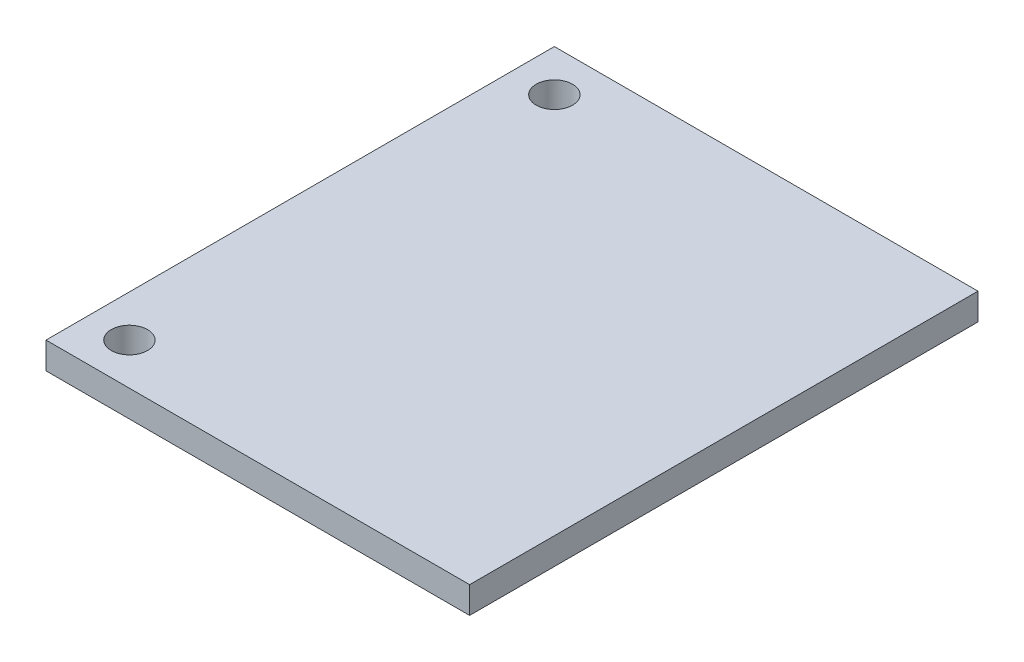
ISO-10303-21;
HEADER;
FILE_DESCRIPTION(('STEP AP214'),'2;1');
FILE_NAME('part.step','',(''),(''),'','','');
FILE_SCHEMA(('AUTOMOTIVE_DESIGN { 1 0 10303 214 1 1 1 1 }'));
ENDSEC;
DATA;
#1=APPLICATION_CONTEXT('core data for automotive mechanical design processes');
#2=APPLICATION_PROTOCOL_DEFINITION('international standard','automotive_design',2000,#1);
#3=PRODUCT_CONTEXT('',#1,'mechanical');
#4=PRODUCT('Part','Part','',(#3));
#5=PRODUCT_RELATED_PRODUCT_CATEGORY('part','',(#4));
#6=PRODUCT_DEFINITION_FORMATION('','',#4);
#7=PRODUCT_DEFINITION_CONTEXT('part definition',#1,'design');
#8=PRODUCT_DEFINITION('design','',#6,#7);
#9=PRODUCT_DEFINITION_SHAPE('','',#8);
#10=(LENGTH_UNIT() NAMED_UNIT(*) SI_UNIT(.MILLI.,.METRE.));
#11=(NAMED_UNIT(*) PLANE_ANGLE_UNIT() SI_UNIT($,.RADIAN.));
#12=(NAMED_UNIT(*) SI_UNIT($,.STERADIAN.) SOLID_ANGLE_UNIT());
#13=UNCERTAINTY_MEASURE_WITH_UNIT(LENGTH_MEASURE(1.E-05),#10,'distance_accuracy_value','');
#14=(GEOMETRIC_REPRESENTATION_CONTEXT(3) GLOBAL_UNCERTAINTY_ASSIGNED_CONTEXT((#13)) GLOBAL_UNIT_ASSIGNED_CONTEXT((#10,
#11,#12)) REPRESENTATION_CONTEXT('',''));
#15=CARTESIAN_POINT('',(0.,0.,0.));
#16=DIRECTION('',(0.,0.,1.));
#17=DIRECTION('',(1.,0.,0.));
#18=AXIS2_PLACEMENT_3D('',#15,#16,#17);
#19=CARTESIAN_POINT('',(12.7,1.6,-15.24));
#20=DIRECTION('',(-1.,0.,0.));
#21=DIRECTION('',(0.,0.,1.));
#22=AXIS2_PLACEMENT_3D('',#19,#20,#21);
#23=PLANE('',#22);
#24=DIRECTION('',(0.,0.,-1.));
#25=VECTOR('',#24,1.);
#26=CARTESIAN_POINT('',(12.7,0.,-15.24));
#27=LINE('',#26,#25);
#28=CARTESIAN_POINT('',(12.7,0.,15.24));
#29=VERTEX_POINT('',#28);
#30=CARTESIAN_POINT('',(12.7,0.,-15.24));
#31=VERTEX_POINT('',#30);
#32=EDGE_CURVE('E97',#29,#31,#27,.T.);
#33=ORIENTED_EDGE('',*,*,#32,.T.);
#34=DIRECTION('',(0.,-1.,0.));
#35=VECTOR('',#34,1.);
#36=CARTESIAN_POINT('',(12.7,1.6,-15.24));
#37=LINE('',#36,#35);
#38=CARTESIAN_POINT('',(12.7,1.6,-15.24));
#39=VERTEX_POINT('',#38);
#40=EDGE_CURVE('E11',#39,#31,#37,.T.);
#41=ORIENTED_EDGE('',*,*,#40,.F.);
#42=DIRECTION('',(0.,0.,-1.));
#43=VECTOR('',#42,1.);
#44=CARTESIAN_POINT('',(12.7,1.6,-15.24));
#45=LINE('',#44,#43);
#46=CARTESIAN_POINT('',(12.7,1.6,15.24));
#47=VERTEX_POINT('',#46);
#48=EDGE_CURVE('E85',#47,#39,#45,.T.);
#49=ORIENTED_EDGE('',*,*,#48,.F.);
#50=DIRECTION('',(0.,-1.,0.));
#51=VECTOR('',#50,1.);
#52=CARTESIAN_POINT('',(12.7,1.6,15.24));
#53=LINE('',#52,#51);
#54=EDGE_CURVE('E93',#47,#29,#53,.T.);
#55=ORIENTED_EDGE('',*,*,#54,.T.);
#56=EDGE_LOOP('',(#33,#41,#49,#55));
#57=FACE_BOUND('',#56,.T.);
#58=ADVANCED_FACE('F34',(#57),#23,.F.);
#59=CARTESIAN_POINT('',(-12.7,1.6,-15.24));
#60=DIRECTION('',(0.,0.,1.));
#61=DIRECTION('',(1.,0.,0.));
#62=AXIS2_PLACEMENT_3D('',#59,#60,#61);
#63=PLANE('',#62);
#64=DIRECTION('',(-1.,0.,0.));
#65=VECTOR('',#64,1.);
#66=CARTESIAN_POINT('',(-12.7,0.,-15.24));
#67=LINE('',#66,#65);
#68=CARTESIAN_POINT('',(-12.7,0.,-15.24));
#69=VERTEX_POINT('',#68);
#70=EDGE_CURVE('E89',#31,#69,#67,.T.);
#71=ORIENTED_EDGE('',*,*,#70,.T.);
#72=DIRECTION('',(0.,-1.,0.));
#73=VECTOR('',#72,1.);
#74=CARTESIAN_POINT('',(-12.7,1.6,-15.24));
#75=LINE('',#74,#73);
#76=CARTESIAN_POINT('',(-12.7,1.6,-15.24));
#77=VERTEX_POINT('',#76);
#78=EDGE_CURVE('E42',#77,#69,#75,.T.);
#79=ORIENTED_EDGE('',*,*,#78,.F.);
#80=DIRECTION('',(-1.,0.,0.));
#81=VECTOR('',#80,1.);
#82=CARTESIAN_POINT('',(-12.7,1.6,-15.24));
#83=LINE('',#82,#81);
#84=EDGE_CURVE('E80',#39,#77,#83,.T.);
#85=ORIENTED_EDGE('',*,*,#84,.F.);
#86=ORIENTED_EDGE('',*,*,#40,.T.);
#87=EDGE_LOOP('',(#71,#79,#85,#86));
#88=FACE_BOUND('',#87,.T.);
#89=ADVANCED_FACE('F88',(#88),#63,.F.);
#90=CARTESIAN_POINT('',(-12.7,1.6,-15.24));
#91=DIRECTION('',(1.,0.,0.));
#92=DIRECTION('',(0.,0.,-1.));
#93=AXIS2_PLACEMENT_3D('',#90,#91,#92);
#94=PLANE('',#93);
#95=DIRECTION('',(0.,0.,1.));
#96=VECTOR('',#95,1.);
#97=CARTESIAN_POINT('',(-12.7,0.,-15.24));
#98=LINE('',#97,#96);
#99=CARTESIAN_POINT('',(-12.7,0.,15.24));
#100=VERTEX_POINT('',#99);
#101=EDGE_CURVE('E67',#69,#100,#98,.T.);
#102=ORIENTED_EDGE('',*,*,#101,.T.);
#103=DIRECTION('',(0.,-1.,0.));
#104=VECTOR('',#103,1.);
#105=CARTESIAN_POINT('',(-12.7,1.6,15.24));
#106=LINE('',#105,#104);
#107=CARTESIAN_POINT('',(-12.7,1.6,15.24));
#108=VERTEX_POINT('',#107);
#109=EDGE_CURVE('E90',#108,#100,#106,.T.);
#110=ORIENTED_EDGE('',*,*,#109,.F.);
#111=DIRECTION('',(0.,0.,1.));
#112=VECTOR('',#111,1.);
#113=CARTESIAN_POINT('',(-12.7,1.6,-15.24));
#114=LINE('',#113,#112);
#115=EDGE_CURVE('E83',#77,#108,#114,.T.);
#116=ORIENTED_EDGE('',*,*,#115,.F.);
#117=ORIENTED_EDGE('',*,*,#78,.T.);
#118=EDGE_LOOP('',(#102,#110,#116,#117));
#119=FACE_BOUND('',#118,.T.);
#120=ADVANCED_FACE('F91',(#119),#94,.F.);
#121=CARTESIAN_POINT('',(-12.7,1.6,15.24));
#122=DIRECTION('',(0.,0.,-1.));
#123=DIRECTION('',(-1.,0.,0.));
#124=AXIS2_PLACEMENT_3D('',#121,#122,#123);
#125=PLANE('',#124);
#126=DIRECTION('',(1.,0.,0.));
#127=VECTOR('',#126,1.);
#128=CARTESIAN_POINT('',(-12.7,0.,15.24));
#129=LINE('',#128,#127);
#130=EDGE_CURVE('E73',#100,#29,#129,.T.);
#131=ORIENTED_EDGE('',*,*,#130,.T.);
#132=ORIENTED_EDGE('',*,*,#54,.F.);
#133=DIRECTION('',(1.,0.,0.));
#134=VECTOR('',#133,1.);
#135=CARTESIAN_POINT('',(-12.7,1.6,15.24));
#136=LINE('',#135,#134);
#137=EDGE_CURVE('E50',#108,#47,#136,.T.);
#138=ORIENTED_EDGE('',*,*,#137,.F.);
#139=ORIENTED_EDGE('',*,*,#109,.T.);
#140=EDGE_LOOP('',(#131,#132,#138,#139));
#141=FACE_BOUND('',#140,.T.);
#142=ADVANCED_FACE('F105',(#141),#125,.F.);
#143=CARTESIAN_POINT('',(0.,1.6,0.));
#144=DIRECTION('',(0.,1.,0.));
#145=DIRECTION('',(0.,0.,1.));
#146=AXIS2_PLACEMENT_3D('',#143,#144,#145);
#147=PLANE('',#146);
#148=CARTESIAN_POINT('',(-10.2,1.6,12.74));
#149=DIRECTION('',(0.,-1.,0.));
#150=DIRECTION('',(0.,0.,-1.));
#151=AXIS2_PLACEMENT_3D('',#148,#149,#150);
#152=CIRCLE('',#151,1.09);
#153=CARTESIAN_POINT('',(-10.2,1.6,11.65));
#154=VERTEX_POINT('',#153);
#155=EDGE_CURVE('E117',#154,#154,#152,.T.);
#156=ORIENTED_EDGE('',*,*,#155,.T.);
#157=EDGE_LOOP('',(#156));
#158=FACE_BOUND('',#157,.T.);
#159=CARTESIAN_POINT('',(-10.2,1.6,-12.74));
#160=DIRECTION('',(0.,1.,0.));
#161=DIRECTION('',(0.,0.,1.));
#162=AXIS2_PLACEMENT_3D('',#159,#160,#161);
#163=CIRCLE('',#162,1.09);
#164=CARTESIAN_POINT('',(-10.2,1.6,-11.65));
#165=VERTEX_POINT('',#164);
#166=EDGE_CURVE('E111',#165,#165,#163,.T.);
#167=ORIENTED_EDGE('',*,*,#166,.F.);
#168=EDGE_LOOP('',(#167));
#169=FACE_BOUND('',#168,.T.);
#170=ORIENTED_EDGE('',*,*,#48,.T.);
#171=ORIENTED_EDGE('',*,*,#84,.T.);
#172=ORIENTED_EDGE('',*,*,#115,.T.);
#173=ORIENTED_EDGE('',*,*,#137,.T.);
#174=EDGE_LOOP('',(#170,#171,#172,#173));
#175=FACE_BOUND('',#174,.T.);
#176=ADVANCED_FACE('F81',(#158,#169,#175),#147,.T.);
#177=CARTESIAN_POINT('',(0.,0.,0.));
#178=DIRECTION('',(0.,1.,0.));
#179=DIRECTION('',(0.,0.,1.));
#180=AXIS2_PLACEMENT_3D('',#177,#178,#179);
#181=PLANE('',#180);
#182=CARTESIAN_POINT('',(-10.2,0.,12.74));
#183=DIRECTION('',(0.,-1.,0.));
#184=DIRECTION('',(0.,0.,-1.));
#185=AXIS2_PLACEMENT_3D('',#182,#183,#184);
#186=CIRCLE('',#185,1.09);
#187=CARTESIAN_POINT('',(-10.2,0.,11.65));
#188=VERTEX_POINT('',#187);
#189=EDGE_CURVE('E114',#188,#188,#186,.T.);
#190=ORIENTED_EDGE('',*,*,#189,.F.);
#191=EDGE_LOOP('',(#190));
#192=FACE_BOUND('',#191,.T.);
#193=CARTESIAN_POINT('',(-10.2,0.,-12.74));
#194=DIRECTION('',(0.,1.,0.));
#195=DIRECTION('',(0.,0.,1.));
#196=AXIS2_PLACEMENT_3D('',#193,#194,#195);
#197=CIRCLE('',#196,1.09);
#198=CARTESIAN_POINT('',(-10.2,0.,-11.65));
#199=VERTEX_POINT('',#198);
#200=EDGE_CURVE('E100',#199,#199,#197,.T.);
#201=ORIENTED_EDGE('',*,*,#200,.T.);
#202=EDGE_LOOP('',(#201));
#203=FACE_BOUND('',#202,.T.);
#204=ORIENTED_EDGE('',*,*,#32,.F.);
#205=ORIENTED_EDGE('',*,*,#130,.F.);
#206=ORIENTED_EDGE('',*,*,#101,.F.);
#207=ORIENTED_EDGE('',*,*,#70,.F.);
#208=EDGE_LOOP('',(#204,#205,#206,#207));
#209=FACE_BOUND('',#208,.T.);
#210=ADVANCED_FACE('F108',(#192,#203,#209),#181,.F.);
#211=CARTESIAN_POINT('',(-10.2,0.,-12.74));
#212=DIRECTION('',(0.,1.,0.));
#213=DIRECTION('',(0.,0.,1.));
#214=AXIS2_PLACEMENT_3D('',#211,#212,#213);
#215=CYLINDRICAL_SURFACE('',#214,1.09);
#216=ORIENTED_EDGE('',*,*,#200,.F.);
#217=EDGE_LOOP('',(#216));
#218=FACE_BOUND('',#217,.T.);
#219=ORIENTED_EDGE('',*,*,#166,.T.);
#220=EDGE_LOOP('',(#219));
#221=FACE_BOUND('',#220,.T.);
#222=ADVANCED_FACE('F128',(#218,#221),#215,.F.);
#223=CARTESIAN_POINT('',(-10.2,0.,12.74));
#224=DIRECTION('',(0.,1.,0.));
#225=DIRECTION('',(0.,0.,1.));
#226=AXIS2_PLACEMENT_3D('',#223,#224,#225);
#227=CYLINDRICAL_SURFACE('',#226,1.09);
#228=ORIENTED_EDGE('',*,*,#189,.T.);
#229=EDGE_LOOP('',(#228));
#230=FACE_BOUND('',#229,.T.);
#231=ORIENTED_EDGE('',*,*,#155,.F.);
#232=EDGE_LOOP('',(#231));
#233=FACE_BOUND('',#232,.T.);
#234=ADVANCED_FACE('F123',(#230,#233),#227,.F.);
#235=CLOSED_SHELL('',(#58,#89,#120,#142,#176,#210,#222,#234));
#236=MANIFOLD_SOLID_BREP('B2',#235);
#237=ADVANCED_BREP_SHAPE_REPRESENTATION('',(#18,#236),#14);
#238=SHAPE_DEFINITION_REPRESENTATION(#9,#237);
ENDSEC;
END-ISO-10303-21;
